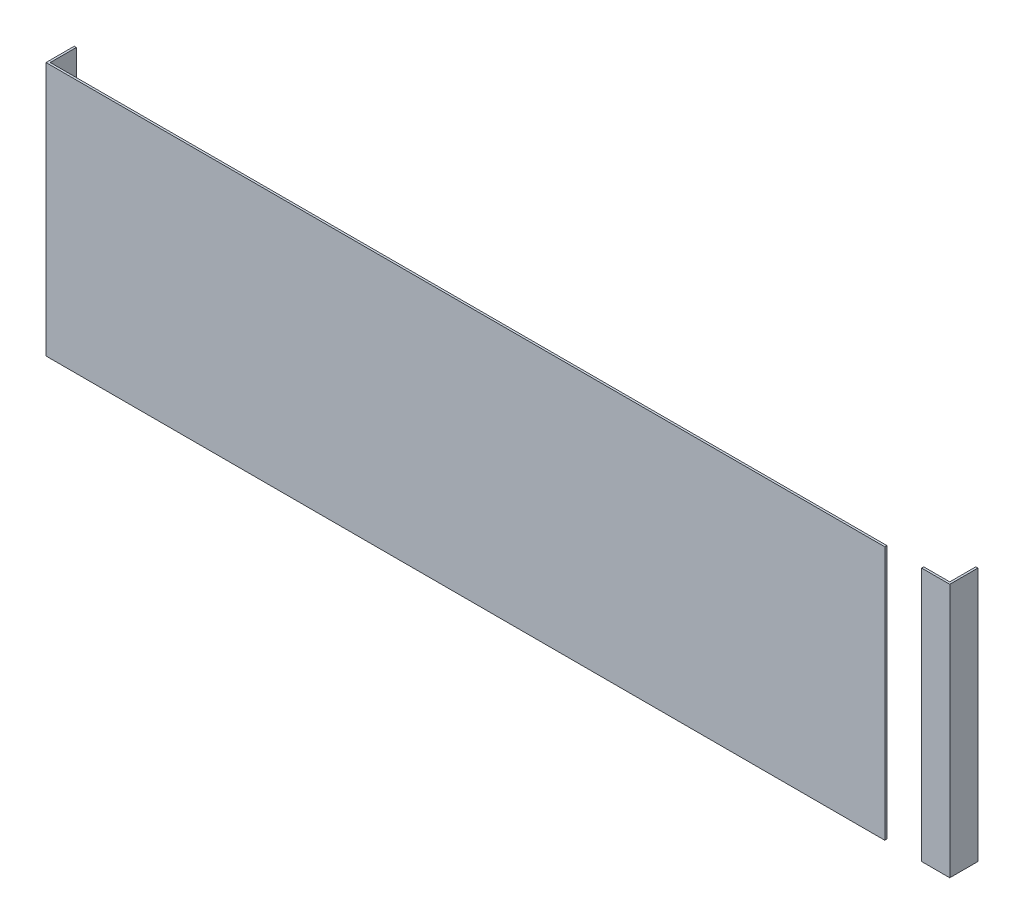
ISO-10303-21;
HEADER;
FILE_DESCRIPTION(('STEP AP214'),'2;1');
FILE_NAME('part.step','',(''),(''),'','','');
FILE_SCHEMA(('AUTOMOTIVE_DESIGN { 1 0 10303 214 1 1 1 1 }'));
ENDSEC;
DATA;
#1=APPLICATION_CONTEXT('core data for automotive mechanical design processes');
#2=APPLICATION_PROTOCOL_DEFINITION('international standard','automotive_design',2000,#1);
#3=PRODUCT_CONTEXT('',#1,'mechanical');
#4=PRODUCT('Part','Part','',(#3));
#5=PRODUCT_RELATED_PRODUCT_CATEGORY('part','',(#4));
#6=PRODUCT_DEFINITION_FORMATION('','',#4);
#7=PRODUCT_DEFINITION_CONTEXT('part definition',#1,'design');
#8=PRODUCT_DEFINITION('design','',#6,#7);
#9=PRODUCT_DEFINITION_SHAPE('','',#8);
#10=(LENGTH_UNIT() NAMED_UNIT(*) SI_UNIT(.MILLI.,.METRE.));
#11=(NAMED_UNIT(*) PLANE_ANGLE_UNIT() SI_UNIT($,.RADIAN.));
#12=(NAMED_UNIT(*) SI_UNIT($,.STERADIAN.) SOLID_ANGLE_UNIT());
#13=UNCERTAINTY_MEASURE_WITH_UNIT(LENGTH_MEASURE(1.E-05),#10,'distance_accuracy_value','');
#14=(GEOMETRIC_REPRESENTATION_CONTEXT(3) GLOBAL_UNCERTAINTY_ASSIGNED_CONTEXT((#13)) GLOBAL_UNIT_ASSIGNED_CONTEXT((#10,
#11,#12)) REPRESENTATION_CONTEXT('',''));
#15=CARTESIAN_POINT('',(0.,0.,0.));
#16=DIRECTION('',(0.,0.,1.));
#17=DIRECTION('',(1.,0.,0.));
#18=AXIS2_PLACEMENT_3D('',#15,#16,#17);
#19=CARTESIAN_POINT('',(670.,300.,40.));
#20=DIRECTION('',(0.,0.,-1.));
#21=DIRECTION('',(-1.,0.,0.));
#22=AXIS2_PLACEMENT_3D('',#19,#20,#21);
#23=PLANE('',#22);
#24=DIRECTION('',(0.,-1.,0.));
#25=VECTOR('',#24,1.);
#26=CARTESIAN_POINT('',(624.,300.,40.));
#27=LINE('',#26,#25);
#28=CARTESIAN_POINT('',(624.,300.,40.));
#29=VERTEX_POINT('',#28);
#30=CARTESIAN_POINT('',(624.,120.,40.));
#31=VERTEX_POINT('',#30);
#32=EDGE_CURVE('E60',#29,#31,#27,.T.);
#33=ORIENTED_EDGE('',*,*,#32,.F.);
#34=DIRECTION('',(1.,0.,0.));
#35=VECTOR('',#34,1.);
#36=CARTESIAN_POINT('',(670.,300.,40.));
#37=LINE('',#36,#35);
#38=CARTESIAN_POINT('',(30.,300.,40.));
#39=VERTEX_POINT('',#38);
#40=EDGE_CURVE('E106',#39,#29,#37,.T.);
#41=ORIENTED_EDGE('',*,*,#40,.F.);
#42=DIRECTION('',(0.,-1.,0.));
#43=VECTOR('',#42,1.);
#44=CARTESIAN_POINT('',(30.,300.,40.));
#45=LINE('',#44,#43);
#46=CARTESIAN_POINT('',(30.,120.,40.));
#47=VERTEX_POINT('',#46);
#48=EDGE_CURVE('E119',#39,#47,#45,.T.);
#49=ORIENTED_EDGE('',*,*,#48,.T.);
#50=DIRECTION('',(1.,0.,0.));
#51=VECTOR('',#50,1.);
#52=CARTESIAN_POINT('',(670.,120.,40.));
#53=LINE('',#52,#51);
#54=EDGE_CURVE('E54',#47,#31,#53,.T.);
#55=ORIENTED_EDGE('',*,*,#54,.T.);
#56=EDGE_LOOP('',(#33,#41,#49,#55));
#57=FACE_BOUND('',#56,.T.);
#58=ADVANCED_FACE('F51',(#57),#23,.F.);
#59=CARTESIAN_POINT('',(31.5,300.,38.5));
#60=DIRECTION('',(0.,0.,1.));
#61=DIRECTION('',(1.,0.,0.));
#62=AXIS2_PLACEMENT_3D('',#59,#60,#61);
#63=PLANE('',#62);
#64=DIRECTION('',(0.,1.,0.));
#65=VECTOR('',#64,1.);
#66=CARTESIAN_POINT('',(624.,300.,38.5));
#67=LINE('',#66,#65);
#68=CARTESIAN_POINT('',(624.,120.,38.5));
#69=VERTEX_POINT('',#68);
#70=CARTESIAN_POINT('',(624.,300.,38.5));
#71=VERTEX_POINT('',#70);
#72=EDGE_CURVE('E12',#69,#71,#67,.T.);
#73=ORIENTED_EDGE('',*,*,#72,.F.);
#74=DIRECTION('',(-1.,0.,0.));
#75=VECTOR('',#74,1.);
#76=CARTESIAN_POINT('',(31.5,120.,38.5));
#77=LINE('',#76,#75);
#78=CARTESIAN_POINT('',(31.5,120.,38.5));
#79=VERTEX_POINT('',#78);
#80=EDGE_CURVE('E112',#69,#79,#77,.T.);
#81=ORIENTED_EDGE('',*,*,#80,.T.);
#82=DIRECTION('',(0.,-1.,0.));
#83=VECTOR('',#82,1.);
#84=CARTESIAN_POINT('',(31.5,300.,38.5));
#85=LINE('',#84,#83);
#86=CARTESIAN_POINT('',(31.5,300.,38.5));
#87=VERTEX_POINT('',#86);
#88=EDGE_CURVE('E133',#87,#79,#85,.T.);
#89=ORIENTED_EDGE('',*,*,#88,.F.);
#90=DIRECTION('',(-1.,0.,0.));
#91=VECTOR('',#90,1.);
#92=CARTESIAN_POINT('',(31.5,300.,38.5));
#93=LINE('',#92,#91);
#94=EDGE_CURVE('E114',#71,#87,#93,.T.);
#95=ORIENTED_EDGE('',*,*,#94,.F.);
#96=EDGE_LOOP('',(#73,#81,#89,#95));
#97=FACE_BOUND('',#96,.T.);
#98=ADVANCED_FACE('F110',(#97),#63,.F.);
#99=CARTESIAN_POINT('',(0.,300.,0.));
#100=DIRECTION('',(0.,-1.,0.));
#101=DIRECTION('',(0.,0.,-1.));
#102=AXIS2_PLACEMENT_3D('',#99,#100,#101);
#103=PLANE('',#102);
#104=DIRECTION('',(0.,0.,-1.));
#105=VECTOR('',#104,1.);
#106=CARTESIAN_POINT('',(624.,300.,41.));
#107=LINE('',#106,#105);
#108=EDGE_CURVE('E67',#29,#71,#107,.T.);
#109=ORIENTED_EDGE('',*,*,#108,.T.);
#110=ORIENTED_EDGE('',*,*,#94,.T.);
#111=DIRECTION('',(0.,0.,-1.));
#112=VECTOR('',#111,1.);
#113=CARTESIAN_POINT('',(31.5,300.,20.));
#114=LINE('',#113,#112);
#115=CARTESIAN_POINT('',(31.5,300.,20.));
#116=VERTEX_POINT('',#115);
#117=EDGE_CURVE('E124',#87,#116,#114,.T.);
#118=ORIENTED_EDGE('',*,*,#117,.T.);
#119=DIRECTION('',(-1.,0.,0.));
#120=VECTOR('',#119,1.);
#121=CARTESIAN_POINT('',(30.,300.,20.));
#122=LINE('',#121,#120);
#123=CARTESIAN_POINT('',(30.,300.,20.));
#124=VERTEX_POINT('',#123);
#125=EDGE_CURVE('E129',#116,#124,#122,.T.);
#126=ORIENTED_EDGE('',*,*,#125,.T.);
#127=DIRECTION('',(0.,0.,1.));
#128=VECTOR('',#127,1.);
#129=CARTESIAN_POINT('',(30.,300.,40.));
#130=LINE('',#129,#128);
#131=EDGE_CURVE('E123',#124,#39,#130,.T.);
#132=ORIENTED_EDGE('',*,*,#131,.T.);
#133=ORIENTED_EDGE('',*,*,#40,.T.);
#134=EDGE_LOOP('',(#109,#110,#118,#126,#132,#133));
#135=FACE_BOUND('',#134,.T.);
#136=ADVANCED_FACE('F151',(#135),#103,.F.);
#137=CARTESIAN_POINT('',(0.,120.,0.));
#138=DIRECTION('',(0.,-1.,0.));
#139=DIRECTION('',(0.,0.,-1.));
#140=AXIS2_PLACEMENT_3D('',#137,#138,#139);
#141=PLANE('',#140);
#142=ORIENTED_EDGE('',*,*,#80,.F.);
#143=DIRECTION('',(0.,0.,1.));
#144=VECTOR('',#143,1.);
#145=CARTESIAN_POINT('',(624.,120.,0.));
#146=LINE('',#145,#144);
#147=EDGE_CURVE('E98',#69,#31,#146,.T.);
#148=ORIENTED_EDGE('',*,*,#147,.T.);
#149=ORIENTED_EDGE('',*,*,#54,.F.);
#150=DIRECTION('',(0.,0.,1.));
#151=VECTOR('',#150,1.);
#152=CARTESIAN_POINT('',(30.,120.,40.));
#153=LINE('',#152,#151);
#154=CARTESIAN_POINT('',(30.,120.,20.));
#155=VERTEX_POINT('',#154);
#156=EDGE_CURVE('E137',#155,#47,#153,.T.);
#157=ORIENTED_EDGE('',*,*,#156,.F.);
#158=DIRECTION('',(-1.,0.,0.));
#159=VECTOR('',#158,1.);
#160=CARTESIAN_POINT('',(30.,120.,20.));
#161=LINE('',#160,#159);
#162=CARTESIAN_POINT('',(31.5,120.,20.));
#163=VERTEX_POINT('',#162);
#164=EDGE_CURVE('E134',#163,#155,#161,.T.);
#165=ORIENTED_EDGE('',*,*,#164,.F.);
#166=DIRECTION('',(0.,0.,-1.));
#167=VECTOR('',#166,1.);
#168=CARTESIAN_POINT('',(31.5,120.,20.));
#169=LINE('',#168,#167);
#170=EDGE_CURVE('E105',#79,#163,#169,.T.);
#171=ORIENTED_EDGE('',*,*,#170,.F.);
#172=EDGE_LOOP('',(#142,#148,#149,#157,#165,#171));
#173=FACE_BOUND('',#172,.T.);
#174=ADVANCED_FACE('F116',(#173),#141,.T.);
#175=CARTESIAN_POINT('',(31.5,300.,20.));
#176=DIRECTION('',(-1.,0.,0.));
#177=DIRECTION('',(0.,0.,1.));
#178=AXIS2_PLACEMENT_3D('',#175,#176,#177);
#179=PLANE('',#178);
#180=ORIENTED_EDGE('',*,*,#170,.T.);
#181=DIRECTION('',(0.,-1.,0.));
#182=VECTOR('',#181,1.);
#183=CARTESIAN_POINT('',(31.5,300.,20.));
#184=LINE('',#183,#182);
#185=EDGE_CURVE('E136',#116,#163,#184,.T.);
#186=ORIENTED_EDGE('',*,*,#185,.F.);
#187=ORIENTED_EDGE('',*,*,#117,.F.);
#188=ORIENTED_EDGE('',*,*,#88,.T.);
#189=EDGE_LOOP('',(#180,#186,#187,#188));
#190=FACE_BOUND('',#189,.T.);
#191=ADVANCED_FACE('F147',(#190),#179,.F.);
#192=CARTESIAN_POINT('',(30.,300.,20.));
#193=DIRECTION('',(0.,0.,1.));
#194=DIRECTION('',(1.,0.,0.));
#195=AXIS2_PLACEMENT_3D('',#192,#193,#194);
#196=PLANE('',#195);
#197=ORIENTED_EDGE('',*,*,#164,.T.);
#198=DIRECTION('',(0.,-1.,0.));
#199=VECTOR('',#198,1.);
#200=CARTESIAN_POINT('',(30.,300.,20.));
#201=LINE('',#200,#199);
#202=EDGE_CURVE('E127',#124,#155,#201,.T.);
#203=ORIENTED_EDGE('',*,*,#202,.F.);
#204=ORIENTED_EDGE('',*,*,#125,.F.);
#205=ORIENTED_EDGE('',*,*,#185,.T.);
#206=EDGE_LOOP('',(#197,#203,#204,#205));
#207=FACE_BOUND('',#206,.T.);
#208=ADVANCED_FACE('F161',(#207),#196,.F.);
#209=CARTESIAN_POINT('',(30.,300.,40.));
#210=DIRECTION('',(1.,0.,0.));
#211=DIRECTION('',(0.,0.,-1.));
#212=AXIS2_PLACEMENT_3D('',#209,#210,#211);
#213=PLANE('',#212);
#214=ORIENTED_EDGE('',*,*,#156,.T.);
#215=ORIENTED_EDGE('',*,*,#48,.F.);
#216=ORIENTED_EDGE('',*,*,#131,.F.);
#217=ORIENTED_EDGE('',*,*,#202,.T.);
#218=EDGE_LOOP('',(#214,#215,#216,#217));
#219=FACE_BOUND('',#218,.T.);
#220=ADVANCED_FACE('F159',(#219),#213,.F.);
#221=CARTESIAN_POINT('',(624.,120.,41.));
#222=DIRECTION('',(1.,0.,0.));
#223=DIRECTION('',(0.,0.,-1.));
#224=AXIS2_PLACEMENT_3D('',#221,#222,#223);
#225=PLANE('',#224);
#226=ORIENTED_EDGE('',*,*,#32,.T.);
#227=ORIENTED_EDGE('',*,*,#147,.F.);
#228=ORIENTED_EDGE('',*,*,#72,.T.);
#229=ORIENTED_EDGE('',*,*,#108,.F.);
#230=EDGE_LOOP('',(#226,#227,#228,#229));
#231=FACE_BOUND('',#230,.T.);
#232=ADVANCED_FACE('F100',(#231),#225,.T.);
#233=CLOSED_SHELL('',(#58,#98,#136,#174,#191,#208,#220,#232));
#234=MANIFOLD_SOLID_BREP('B2',#233);
#235=CARTESIAN_POINT('',(670.,300.,20.));
#236=DIRECTION('',(-1.,0.,0.));
#237=DIRECTION('',(0.,0.,1.));
#238=AXIS2_PLACEMENT_3D('',#235,#236,#237);
#239=PLANE('',#238);
#240=DIRECTION('',(0.,0.,-1.));
#241=VECTOR('',#240,1.);
#242=CARTESIAN_POINT('',(670.,120.,20.));
#243=LINE('',#242,#241);
#244=CARTESIAN_POINT('',(670.,120.,40.));
#245=VERTEX_POINT('',#244);
#246=CARTESIAN_POINT('',(670.,120.,20.));
#247=VERTEX_POINT('',#246);
#248=EDGE_CURVE('E314',#245,#247,#243,.T.);
#249=ORIENTED_EDGE('',*,*,#248,.T.);
#250=DIRECTION('',(0.,-1.,0.));
#251=VECTOR('',#250,1.);
#252=CARTESIAN_POINT('',(670.,300.,20.));
#253=LINE('',#252,#251);
#254=CARTESIAN_POINT('',(670.,300.,20.));
#255=VERTEX_POINT('',#254);
#256=EDGE_CURVE('E322',#255,#247,#253,.T.);
#257=ORIENTED_EDGE('',*,*,#256,.F.);
#258=DIRECTION('',(0.,0.,-1.));
#259=VECTOR('',#258,1.);
#260=CARTESIAN_POINT('',(670.,300.,20.));
#261=LINE('',#260,#259);
#262=CARTESIAN_POINT('',(670.,300.,40.));
#263=VERTEX_POINT('',#262);
#264=EDGE_CURVE('E300',#263,#255,#261,.T.);
#265=ORIENTED_EDGE('',*,*,#264,.F.);
#266=DIRECTION('',(0.,-1.,0.));
#267=VECTOR('',#266,1.);
#268=CARTESIAN_POINT('',(670.,300.,40.));
#269=LINE('',#268,#267);
#270=EDGE_CURVE('E235',#263,#245,#269,.T.);
#271=ORIENTED_EDGE('',*,*,#270,.T.);
#272=EDGE_LOOP('',(#249,#257,#265,#271));
#273=FACE_BOUND('',#272,.T.);
#274=ADVANCED_FACE('F227',(#273),#239,.F.);
#275=CARTESIAN_POINT('',(668.5,300.,20.));
#276=DIRECTION('',(0.,0.,1.));
#277=DIRECTION('',(1.,0.,0.));
#278=AXIS2_PLACEMENT_3D('',#275,#276,#277);
#279=PLANE('',#278);
#280=DIRECTION('',(-1.,0.,0.));
#281=VECTOR('',#280,1.);
#282=CARTESIAN_POINT('',(668.5,120.,20.));
#283=LINE('',#282,#281);
#284=CARTESIAN_POINT('',(668.5,120.,20.));
#285=VERTEX_POINT('',#284);
#286=EDGE_CURVE('E316',#247,#285,#283,.T.);
#287=ORIENTED_EDGE('',*,*,#286,.T.);
#288=DIRECTION('',(0.,-1.,0.));
#289=VECTOR('',#288,1.);
#290=CARTESIAN_POINT('',(668.5,300.,20.));
#291=LINE('',#290,#289);
#292=CARTESIAN_POINT('',(668.5,300.,20.));
#293=VERTEX_POINT('',#292);
#294=EDGE_CURVE('E320',#293,#285,#291,.T.);
#295=ORIENTED_EDGE('',*,*,#294,.F.);
#296=DIRECTION('',(-1.,0.,0.));
#297=VECTOR('',#296,1.);
#298=CARTESIAN_POINT('',(668.5,300.,20.));
#299=LINE('',#298,#297);
#300=EDGE_CURVE('E303',#255,#293,#299,.T.);
#301=ORIENTED_EDGE('',*,*,#300,.F.);
#302=ORIENTED_EDGE('',*,*,#256,.T.);
#303=EDGE_LOOP('',(#287,#295,#301,#302));
#304=FACE_BOUND('',#303,.T.);
#305=ADVANCED_FACE('F330',(#304),#279,.F.);
#306=CARTESIAN_POINT('',(668.5,300.,38.5));
#307=DIRECTION('',(1.,0.,0.));
#308=DIRECTION('',(0.,0.,-1.));
#309=AXIS2_PLACEMENT_3D('',#306,#307,#308);
#310=PLANE('',#309);
#311=DIRECTION('',(0.,0.,1.));
#312=VECTOR('',#311,1.);
#313=CARTESIAN_POINT('',(668.5,120.,38.5));
#314=LINE('',#313,#312);
#315=CARTESIAN_POINT('',(668.5,120.,38.5));
#316=VERTEX_POINT('',#315);
#317=EDGE_CURVE('E271',#285,#316,#314,.T.);
#318=ORIENTED_EDGE('',*,*,#317,.T.);
#319=DIRECTION('',(0.,-1.,0.));
#320=VECTOR('',#319,1.);
#321=CARTESIAN_POINT('',(668.5,300.,38.5));
#322=LINE('',#321,#320);
#323=CARTESIAN_POINT('',(668.5,300.,38.5));
#324=VERTEX_POINT('',#323);
#325=EDGE_CURVE('E312',#324,#316,#322,.T.);
#326=ORIENTED_EDGE('',*,*,#325,.F.);
#327=DIRECTION('',(0.,0.,1.));
#328=VECTOR('',#327,1.);
#329=CARTESIAN_POINT('',(668.5,300.,38.5));
#330=LINE('',#329,#328);
#331=EDGE_CURVE('E250',#293,#324,#330,.T.);
#332=ORIENTED_EDGE('',*,*,#331,.F.);
#333=ORIENTED_EDGE('',*,*,#294,.T.);
#334=EDGE_LOOP('',(#318,#326,#332,#333));
#335=FACE_BOUND('',#334,.T.);
#336=ADVANCED_FACE('F332',(#335),#310,.F.);
#337=CARTESIAN_POINT('',(0.,120.,0.));
#338=DIRECTION('',(0.,-1.,0.));
#339=DIRECTION('',(0.,0.,-1.));
#340=AXIS2_PLACEMENT_3D('',#337,#338,#339);
#341=PLANE('',#340);
#342=DIRECTION('',(1.,0.,0.));
#343=VECTOR('',#342,1.);
#344=CARTESIAN_POINT('',(670.,120.,40.));
#345=LINE('',#344,#343);
#346=CARTESIAN_POINT('',(650.,120.,40.));
#347=VERTEX_POINT('',#346);
#348=EDGE_CURVE('E292',#347,#245,#345,.T.);
#349=ORIENTED_EDGE('',*,*,#348,.F.);
#350=DIRECTION('',(0.,0.,-1.));
#351=VECTOR('',#350,1.);
#352=CARTESIAN_POINT('',(650.,120.,0.));
#353=LINE('',#352,#351);
#354=CARTESIAN_POINT('',(650.,120.,38.5));
#355=VERTEX_POINT('',#354);
#356=EDGE_CURVE('E49',#347,#355,#353,.T.);
#357=ORIENTED_EDGE('',*,*,#356,.T.);
#358=DIRECTION('',(-1.,0.,0.));
#359=VECTOR('',#358,1.);
#360=CARTESIAN_POINT('',(31.5,120.,38.5));
#361=LINE('',#360,#359);
#362=EDGE_CURVE('E301',#316,#355,#361,.T.);
#363=ORIENTED_EDGE('',*,*,#362,.F.);
#364=ORIENTED_EDGE('',*,*,#317,.F.);
#365=ORIENTED_EDGE('',*,*,#286,.F.);
#366=ORIENTED_EDGE('',*,*,#248,.F.);
#367=EDGE_LOOP('',(#349,#357,#363,#364,#365,#366));
#368=FACE_BOUND('',#367,.T.);
#369=ADVANCED_FACE('F337',(#368),#341,.T.);
#370=CARTESIAN_POINT('',(0.,300.,0.));
#371=DIRECTION('',(0.,-1.,0.));
#372=DIRECTION('',(0.,0.,-1.));
#373=AXIS2_PLACEMENT_3D('',#370,#371,#372);
#374=PLANE('',#373);
#375=DIRECTION('',(0.,0.,-1.));
#376=VECTOR('',#375,1.);
#377=CARTESIAN_POINT('',(650.,300.,41.));
#378=LINE('',#377,#376);
#379=CARTESIAN_POINT('',(650.,300.,40.));
#380=VERTEX_POINT('',#379);
#381=CARTESIAN_POINT('',(650.,300.,38.5));
#382=VERTEX_POINT('',#381);
#383=EDGE_CURVE('E289',#380,#382,#378,.T.);
#384=ORIENTED_EDGE('',*,*,#383,.F.);
#385=DIRECTION('',(1.,0.,0.));
#386=VECTOR('',#385,1.);
#387=CARTESIAN_POINT('',(670.,300.,40.));
#388=LINE('',#387,#386);
#389=EDGE_CURVE('E278',#380,#263,#388,.T.);
#390=ORIENTED_EDGE('',*,*,#389,.T.);
#391=ORIENTED_EDGE('',*,*,#264,.T.);
#392=ORIENTED_EDGE('',*,*,#300,.T.);
#393=ORIENTED_EDGE('',*,*,#331,.T.);
#394=DIRECTION('',(-1.,0.,0.));
#395=VECTOR('',#394,1.);
#396=CARTESIAN_POINT('',(31.5,300.,38.5));
#397=LINE('',#396,#395);
#398=EDGE_CURVE('E296',#324,#382,#397,.T.);
#399=ORIENTED_EDGE('',*,*,#398,.T.);
#400=EDGE_LOOP('',(#384,#390,#391,#392,#393,#399));
#401=FACE_BOUND('',#400,.T.);
#402=ADVANCED_FACE('F294',(#401),#374,.F.);
#403=CARTESIAN_POINT('',(31.5,300.,38.5));
#404=DIRECTION('',(0.,0.,1.));
#405=DIRECTION('',(1.,0.,0.));
#406=AXIS2_PLACEMENT_3D('',#403,#404,#405);
#407=PLANE('',#406);
#408=DIRECTION('',(0.,-1.,0.));
#409=VECTOR('',#408,1.);
#410=CARTESIAN_POINT('',(650.,300.,38.5));
#411=LINE('',#410,#409);
#412=EDGE_CURVE('E242',#382,#355,#411,.T.);
#413=ORIENTED_EDGE('',*,*,#412,.F.);
#414=ORIENTED_EDGE('',*,*,#398,.F.);
#415=ORIENTED_EDGE('',*,*,#325,.T.);
#416=ORIENTED_EDGE('',*,*,#362,.T.);
#417=EDGE_LOOP('',(#413,#414,#415,#416));
#418=FACE_BOUND('',#417,.T.);
#419=ADVANCED_FACE('F335',(#418),#407,.F.);
#420=CARTESIAN_POINT('',(670.,300.,40.));
#421=DIRECTION('',(0.,0.,-1.));
#422=DIRECTION('',(-1.,0.,0.));
#423=AXIS2_PLACEMENT_3D('',#420,#421,#422);
#424=PLANE('',#423);
#425=DIRECTION('',(0.,1.,0.));
#426=VECTOR('',#425,1.);
#427=CARTESIAN_POINT('',(650.,300.,40.));
#428=LINE('',#427,#426);
#429=EDGE_CURVE('E287',#347,#380,#428,.T.);
#430=ORIENTED_EDGE('',*,*,#429,.F.);
#431=ORIENTED_EDGE('',*,*,#348,.T.);
#432=ORIENTED_EDGE('',*,*,#270,.F.);
#433=ORIENTED_EDGE('',*,*,#389,.F.);
#434=EDGE_LOOP('',(#430,#431,#432,#433));
#435=FACE_BOUND('',#434,.T.);
#436=ADVANCED_FACE('F229',(#435),#424,.F.);
#437=CARTESIAN_POINT('',(650.,120.,41.));
#438=DIRECTION('',(-1.,0.,0.));
#439=DIRECTION('',(0.,0.,1.));
#440=AXIS2_PLACEMENT_3D('',#437,#438,#439);
#441=PLANE('',#440);
#442=ORIENTED_EDGE('',*,*,#429,.T.);
#443=ORIENTED_EDGE('',*,*,#383,.T.);
#444=ORIENTED_EDGE('',*,*,#412,.T.);
#445=ORIENTED_EDGE('',*,*,#356,.F.);
#446=EDGE_LOOP('',(#442,#443,#444,#445));
#447=FACE_BOUND('',#446,.T.);
#448=ADVANCED_FACE('F288',(#447),#441,.T.);
#449=CLOSED_SHELL('',(#274,#305,#336,#369,#402,#419,#436,#448));
#450=MANIFOLD_SOLID_BREP('B6',#449);
#451=ADVANCED_BREP_SHAPE_REPRESENTATION('',(#18,#234,#450),#14);
#452=SHAPE_DEFINITION_REPRESENTATION(#9,#451);
ENDSEC;
END-ISO-10303-21;
